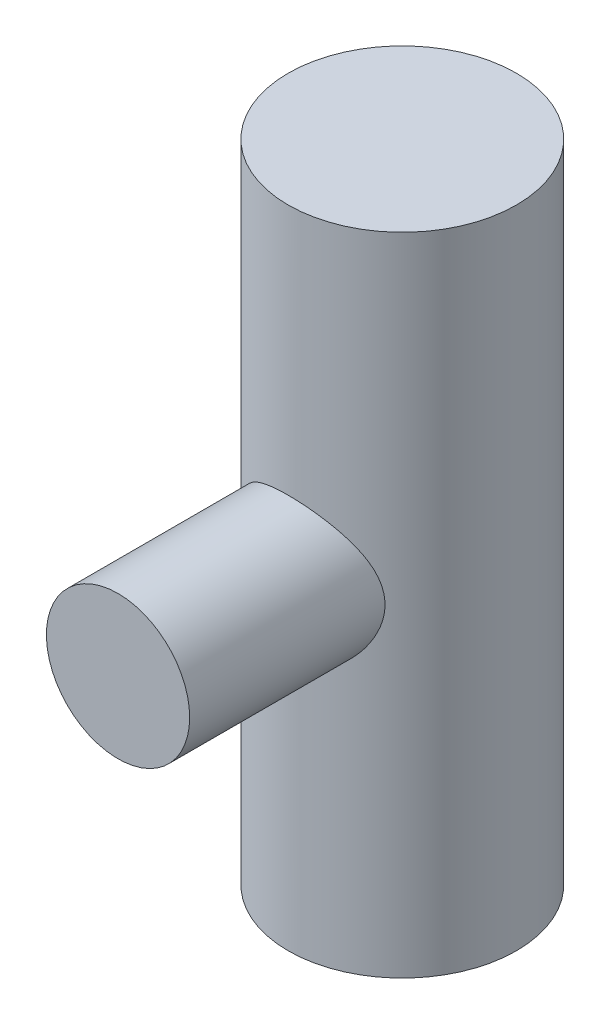
ISO-10303-21;
HEADER;
FILE_DESCRIPTION(('STEP AP214'),'2;1');
FILE_NAME('part.step','',(''),(''),'','','');
FILE_SCHEMA(('AUTOMOTIVE_DESIGN { 1 0 10303 214 1 1 1 1 }'));
ENDSEC;
DATA;
#1=APPLICATION_CONTEXT('core data for automotive mechanical design processes');
#2=APPLICATION_PROTOCOL_DEFINITION('international standard','automotive_design',2000,#1);
#3=PRODUCT_CONTEXT('',#1,'mechanical');
#4=PRODUCT('Part','Part','',(#3));
#5=PRODUCT_RELATED_PRODUCT_CATEGORY('part','',(#4));
#6=PRODUCT_DEFINITION_FORMATION('','',#4);
#7=PRODUCT_DEFINITION_CONTEXT('part definition',#1,'design');
#8=PRODUCT_DEFINITION('design','',#6,#7);
#9=PRODUCT_DEFINITION_SHAPE('','',#8);
#10=(LENGTH_UNIT() NAMED_UNIT(*) SI_UNIT(.MILLI.,.METRE.));
#11=(NAMED_UNIT(*) PLANE_ANGLE_UNIT() SI_UNIT($,.RADIAN.));
#12=(NAMED_UNIT(*) SI_UNIT($,.STERADIAN.) SOLID_ANGLE_UNIT());
#13=UNCERTAINTY_MEASURE_WITH_UNIT(LENGTH_MEASURE(1.E-05),#10,'distance_accuracy_value','');
#14=(GEOMETRIC_REPRESENTATION_CONTEXT(3) GLOBAL_UNCERTAINTY_ASSIGNED_CONTEXT((#13)) GLOBAL_UNIT_ASSIGNED_CONTEXT((#10,
#11,#12)) REPRESENTATION_CONTEXT('',''));
#15=CARTESIAN_POINT('',(0.,0.,0.));
#16=DIRECTION('',(0.,0.,1.));
#17=DIRECTION('',(1.,0.,0.));
#18=AXIS2_PLACEMENT_3D('',#15,#16,#17);
#19=CARTESIAN_POINT('',(0.,-36.068,0.));
#20=DIRECTION('',(0.,1.,0.));
#21=DIRECTION('',(0.,0.,1.));
#22=AXIS2_PLACEMENT_3D('',#19,#20,#21);
#23=CYLINDRICAL_SURFACE('',#22,12.75);
#24=CARTESIAN_POINT('',(0.,36.068,0.));
#25=DIRECTION('',(0.,1.,0.));
#26=DIRECTION('',(0.,0.,1.));
#27=AXIS2_PLACEMENT_3D('',#24,#25,#26);
#28=CIRCLE('',#27,12.75);
#29=CARTESIAN_POINT('',(0.,36.068,12.75));
#30=VERTEX_POINT('',#29);
#31=EDGE_CURVE('E40',#30,#30,#28,.T.);
#32=ORIENTED_EDGE('',*,*,#31,.F.);
#33=EDGE_LOOP('',(#32));
#34=FACE_BOUND('',#33,.T.);
#35=CARTESIAN_POINT('',(0.,-36.068,0.));
#36=DIRECTION('',(0.,1.,0.));
#37=DIRECTION('',(0.,0.,1.));
#38=AXIS2_PLACEMENT_3D('',#35,#36,#37);
#39=CIRCLE('',#38,12.75);
#40=CARTESIAN_POINT('',(0.,-36.068,12.75));
#41=VERTEX_POINT('',#40);
#42=EDGE_CURVE('E10',#41,#41,#39,.T.);
#43=ORIENTED_EDGE('',*,*,#42,.T.);
#44=EDGE_LOOP('',(#43));
#45=FACE_BOUND('',#44,.T.);
#46=CARTESIAN_POINT('',(0.,-8.,12.75));
#47=CARTESIAN_POINT('',(-0.203189766382973,-7.99999976383825,12.7499997385454));
#48=CARTESIAN_POINT('',(-0.406385873344213,-7.99224878717564,12.7451321833283));
#49=CARTESIAN_POINT('',(-0.811220632619126,-7.96135376545343,12.7257813143932));
#50=CARTESIAN_POINT('',(-1.01285859554946,-7.93820326193824,12.7112939662048));
#51=CARTESIAN_POINT('',(-1.41320253033448,-7.87679681695134,12.673036387307));
#52=CARTESIAN_POINT('',(-1.61190413876704,-7.83852036209049,12.6492535507999));
#53=CARTESIAN_POINT('',(-2.00474517611813,-7.74736580920391,12.5929699595354));
#54=CARTESIAN_POINT('',(-2.19888263941247,-7.69448154070404,12.5604655208598));
#55=CARTESIAN_POINT('',(-2.58021992043227,-7.57510194616457,12.4876916924987));
#56=CARTESIAN_POINT('',(-2.76745168430035,-7.50868208407942,12.4474654229557));
#57=CARTESIAN_POINT('',(-3.13511640751292,-7.36275664703233,12.3599868834508));
#58=CARTESIAN_POINT('',(-3.31554669892956,-7.2832460014248,12.3127318916383));
#59=CARTESIAN_POINT('',(-3.66859223478251,-7.1119547048222,12.2121901956111));
#60=CARTESIAN_POINT('',(-3.84121202735987,-7.02018132092362,12.1589070666131));
#61=CARTESIAN_POINT('',(-4.17810487907998,-6.82505455198789,12.0473019796715));
#62=CARTESIAN_POINT('',(-4.34237482156444,-6.72169688848159,11.9889781618623));
#63=CARTESIAN_POINT('',(-4.84727527708861,-6.37793884981828,11.7983972761313));
#64=CARTESIAN_POINT('',(-5.17176058125377,-6.11748738834776,11.6587628111541));
#65=CARTESIAN_POINT('',(-5.77529819934415,-5.5513559523854,11.3719103141199));
#66=CARTESIAN_POINT('',(-6.05428811176334,-5.24561493685909,11.2246822247398));
#67=CARTESIAN_POINT('',(-6.45301886625948,-4.73431922761001,10.9976725999898));
#68=CARTESIAN_POINT('',(-6.58955676700972,-4.5424068199267,10.9161809695766));
#69=CARTESIAN_POINT('',(-6.8459087898482,-4.14599149438221,10.75726511699));
#70=CARTESIAN_POINT('',(-6.9657197419189,-3.94148620052684,10.6798416675295));
#71=CARTESIAN_POINT('',(-7.18742899523231,-3.52097860064546,10.5319093402927));
#72=CARTESIAN_POINT('',(-7.28935148451823,-3.30499234201032,10.4613911834364));
#73=CARTESIAN_POINT('',(-7.47428711151578,-2.86225789214948,10.3300728197832));
#74=CARTESIAN_POINT('',(-7.55730815099648,-2.63551424614157,10.2692685552673));
#75=CARTESIAN_POINT('',(-7.68409465207724,-2.23312435302852,10.1745619472224));
#76=CARTESIAN_POINT('',(-7.73245018409908,-2.0595903102319,10.1377804382398));
#77=CARTESIAN_POINT('',(-7.81758346201417,-1.70822784010463,10.0722777906396));
#78=CARTESIAN_POINT('',(-7.85436403629735,-1.53040047331893,10.0435546831039));
#79=CARTESIAN_POINT('',(-7.91582572369715,-1.17165707333377,9.99518566956534));
#80=CARTESIAN_POINT('',(-7.9405211178199,-0.990744948392088,9.97552905131766));
#81=CARTESIAN_POINT('',(-7.97749960047348,-0.6268509257145,9.94598234779231));
#82=CARTESIAN_POINT('',(-7.98978252393051,-0.443869000484983,9.93609239240181));
#83=CARTESIAN_POINT('',(-8.00174593892089,-0.0767245670503763,9.926460752477));
#84=CARTESIAN_POINT('',(-8.00139208707587,0.107439798184548,9.9267467233835));
#85=CARTESIAN_POINT('',(-7.9880031448844,0.475003431836302,9.93752371706806));
#86=CARTESIAN_POINT('',(-7.97496798909817,0.65840269630005,9.94801479250789));
#87=CARTESIAN_POINT('',(-7.93642111826785,1.02317296232002,9.97879369925801));
#88=CARTESIAN_POINT('',(-7.91090071663604,1.2045424616742,9.99908835126532));
#89=CARTESIAN_POINT('',(-7.8477715182777,1.56389561654914,10.0487107647937));
#90=CARTESIAN_POINT('',(-7.81016245775423,1.74187919809311,10.0780387234377));
#91=CARTESIAN_POINT('',(-7.72441299215733,2.08917611342476,10.1439040046732));
#92=CARTESIAN_POINT('',(-7.67655057904199,2.25859503648008,10.1802489109241));
#93=CARTESIAN_POINT('',(-7.57029776768525,2.59255075648118,10.2595068482014));
#94=CARTESIAN_POINT('',(-7.511903805981,2.75708587892772,10.3024221016307));
#95=CARTESIAN_POINT('',(-7.32171394270438,3.24240671290514,10.4393205695113));
#96=CARTESIAN_POINT('',(-7.17486629518523,3.55508230101124,10.5414915639656));
#97=CARTESIAN_POINT('',(-6.81357494604446,4.21200831340229,10.7792689056088));
#98=CARTESIAN_POINT('',(-6.59161435299496,4.55115042306663,10.9175503621206));
#99=CARTESIAN_POINT('',(-6.22345802110474,5.03083226264147,11.1288471741934));
#100=CARTESIAN_POINT('',(-6.09475413060929,5.18599896574965,11.1999830698381));
#101=CARTESIAN_POINT('',(-5.82592487532627,5.48627408335127,11.3421422077003));
#102=CARTESIAN_POINT('',(-5.68579749696819,5.63138071622087,11.4131654277979));
#103=CARTESIAN_POINT('',(-5.37007805634996,5.93446421243214,11.5654845619847));
#104=CARTESIAN_POINT('',(-5.19248440791714,6.09050307762837,11.6464999462237));
#105=CARTESIAN_POINT('',(-4.8230825473081,6.38701344525527,11.8042658957195));
#106=CARTESIAN_POINT('',(-4.63127954061045,6.52749060198545,11.8810180049369));
#107=CARTESIAN_POINT('',(-4.23421273440465,6.79178290377598,12.0282489583426));
#108=CARTESIAN_POINT('',(-4.02894854898307,6.91559757083486,12.0987276225431));
#109=CARTESIAN_POINT('',(-3.60604740482221,7.1452287487665,12.2314354839807));
#110=CARTESIAN_POINT('',(-3.38841190724006,7.25104737925544,12.2936656525545));
#111=CARTESIAN_POINT('',(-2.95397045228584,7.43821234182123,12.4050050436619));
#112=CARTESIAN_POINT('',(-2.73772846851132,7.52055642983811,12.4546338717001));
#113=CARTESIAN_POINT('',(-2.29694556103576,7.66667693956907,12.5434071998914));
#114=CARTESIAN_POINT('',(-2.07240478159228,7.73045368386746,12.5825518821924));
#115=CARTESIAN_POINT('',(-1.61721562985751,7.83831959160341,12.6491088103432));
#116=CARTESIAN_POINT('',(-1.38657489588689,7.88243224676869,12.6765350540046));
#117=CARTESIAN_POINT('',(-0.921187858068242,7.95026275695523,12.7188234014957));
#118=CARTESIAN_POINT('',(-0.686442276062125,7.9739841617212,12.7336876921247));
#119=CARTESIAN_POINT('',(-0.250644531777243,7.99858946532225,12.7491124233029));
#120=CARTESIAN_POINT('',(-0.0498127312596073,8.00236208570209,12.7514820080524));
#121=CARTESIAN_POINT('',(0.351452186901355,7.99479433786285,12.7467338832671));
#122=CARTESIAN_POINT('',(0.551885324832788,7.98345475949558,12.7396166695679));
#123=CARTESIAN_POINT('',(0.950762116416681,7.94582804512612,12.7160713131565));
#124=CARTESIAN_POINT('',(1.14920596877124,7.91954241747637,12.6996441100071));
#125=CARTESIAN_POINT('',(1.54265466835032,7.85239108195215,12.6578771866512));
#126=CARTESIAN_POINT('',(1.73765945781951,7.81152512946112,12.6325373169156));
#127=CARTESIAN_POINT('',(2.11498001276337,7.71771293373013,12.5747479832677));
#128=CARTESIAN_POINT('',(2.29748815497252,7.66533100580571,12.5426328041609));
#129=CARTESIAN_POINT('',(2.65714293201942,7.5482034552834,12.4713958757544));
#130=CARTESIAN_POINT('',(2.83428781925331,7.48345385188672,12.4322718707679));
#131=CARTESIAN_POINT('',(3.18224650578,7.34224393021765,12.3477869413436));
#132=CARTESIAN_POINT('',(3.35306205014384,7.26578687011389,12.3024277525068));
#133=CARTESIAN_POINT('',(3.68773132198226,7.10178873317444,12.2062896502734));
#134=CARTESIAN_POINT('',(3.85158249120338,7.01424362952171,12.1555087689519));
#135=CARTESIAN_POINT('',(4.36380527796383,6.71734498806751,11.9857010580734));
#136=CARTESIAN_POINT('',(4.69783223403602,6.48781163009487,11.8578582209026));
#137=CARTESIAN_POINT('',(5.32489229930251,5.98395623612856,11.5898494186757));
#138=CARTESIAN_POINT('',(5.61787954952388,5.70958482666112,11.4496699485458));
#139=CARTESIAN_POINT('',(6.0437538721238,5.24648357872212,11.2279215695231));
#140=CARTESIAN_POINT('',(6.19164495365708,5.07110941057417,11.1468431361299));
#141=CARTESIAN_POINT('',(6.47216619253904,4.70784182500623,10.9863420676919));
#142=CARTESIAN_POINT('',(6.60479376230111,4.51994629336994,10.9069197152617));
#143=CARTESIAN_POINT('',(6.97849269995221,3.93860569749435,10.6746803636091));
#144=CARTESIAN_POINT('',(7.19587172274166,3.5269735508085,10.5276233511563));
#145=CARTESIAN_POINT('',(7.52073188913442,2.75245855212331,10.2972060064871));
#146=CARTESIAN_POINT('',(7.6416762386543,2.39730255916311,10.2069578831602));
#147=CARTESIAN_POINT('',(7.78545990744791,1.84992971206199,10.0971615445412));
#148=CARTESIAN_POINT('',(7.82710834127099,1.66509376723765,10.0648316640836));
#149=CARTESIAN_POINT('',(7.89734918116674,1.29149812638804,10.0098149238799));
#150=CARTESIAN_POINT('',(7.92594163830113,1.10273844571146,9.98712802642035));
#151=CARTESIAN_POINT('',(7.96971851480828,0.721539402684301,9.95222974525581));
#152=CARTESIAN_POINT('',(7.98482107493778,0.529084718476012,9.94008232968556));
#153=CARTESIAN_POINT('',(8.00104872241627,0.14320005907496,9.92702533209305));
#154=CARTESIAN_POINT('',(8.00217388418333,-0.0502299109197273,9.92611569023893));
#155=CARTESIAN_POINT('',(7.99042304943018,-0.436435604088139,9.93557717108292));
#156=CARTESIAN_POINT('',(7.97754315008174,-0.629211129865219,9.94595143829868));
#157=CARTESIAN_POINT('',(7.93801532607413,-1.01243389633159,9.97752713378894));
#158=CARTESIAN_POINT('',(7.91136762697396,-1.20288117511243,9.99872838468401));
#159=CARTESIAN_POINT('',(7.84756684935318,-1.56411069733939,10.0488649646799));
#160=CARTESIAN_POINT('',(7.81148923278864,-1.73519688744136,10.0769972774148));
#161=CARTESIAN_POINT('',(7.7286157880417,-2.07336399050864,10.1406963582305));
#162=CARTESIAN_POINT('',(7.68181639137217,-2.24044354946501,10.17626560117));
#163=CARTESIAN_POINT('',(7.52605879286744,-2.73451446676145,10.2926073929771));
#164=CARTESIAN_POINT('',(7.40171078092735,-3.05450664446697,10.3830390862903));
#165=CARTESIAN_POINT('',(7.09538822984088,-3.71576474072398,10.5951570126584));
#166=CARTESIAN_POINT('',(6.90770596774952,-4.05349754889184,10.7194658194389));
#167=CARTESIAN_POINT('',(6.48797839309739,-4.6961104700326,10.978590325681));
#168=CARTESIAN_POINT('',(6.25589749438276,-5.00096392112144,11.1134144015882));
#169=CARTESIAN_POINT('',(5.85165624336075,-5.45993192910108,11.3291798802275));
#170=CARTESIAN_POINT('',(5.69250613078194,-5.62567972367077,11.4101687607189));
#171=CARTESIAN_POINT('',(5.35994642118285,-5.94338646957418,11.5701117549875));
#172=CARTESIAN_POINT('',(5.18653554990932,-6.09534418615435,11.6490656861044));
#173=CARTESIAN_POINT('',(4.82601659330587,-6.38459169533055,11.8029875205485));
#174=CARTESIAN_POINT('',(4.63889953684033,-6.52187173371477,11.8779527567273));
#175=CARTESIAN_POINT('',(4.25180239536673,-6.78058740551841,12.02195140944));
#176=CARTESIAN_POINT('',(4.0518209816033,-6.90202139826898,12.090984211489));
#177=CARTESIAN_POINT('',(3.638817843119,-7.12844816537782,12.2216478117316));
#178=CARTESIAN_POINT('',(3.42572814909731,-7.23334305250242,12.2832340713893));
#179=CARTESIAN_POINT('',(2.988988482321,-7.42446751304267,12.3967458835699));
#180=CARTESIAN_POINT('',(2.76534468648368,-7.51070784320286,12.4486770010805));
#181=CARTESIAN_POINT('',(2.30970985237265,-7.66307948436307,12.5411973851701));
#182=CARTESIAN_POINT('',(2.07774294273341,-7.72926438025348,12.5818168506864));
#183=CARTESIAN_POINT('',(1.60714076391373,-7.84063067878577,12.6505360352971));
#184=CARTESIAN_POINT('',(1.36851048227381,-7.88582736684102,12.6786448650879));
#185=CARTESIAN_POINT('',(0.941528233520768,-7.94663089760269,12.7165650979446));
#186=CARTESIAN_POINT('',(0.754025703324688,-7.96662039193684,12.7290783601568));
#187=CARTESIAN_POINT('',(0.377683994988058,-7.99330545870886,12.7457961863256));
#188=CARTESIAN_POINT('',(0.188844735945044,-8.00000021948893,12.7500002429961));
#189=CARTESIAN_POINT('',(0.,-8.,12.75));
#190=B_SPLINE_CURVE_WITH_KNOTS('',3,(#46,#47,#48,#49,#50,#51,#52,#53,#54,#55,#56,#57,#58,#59,
#60,#61,#62,#63,#64,#65,#66,#67,#68,#69,#70,#71,#72,#73,#74,#75,#76,#77,#78,#79,#80,#81,#82,#83,
#84,#85,#86,#87,#88,#89,#90,#91,#92,#93,#94,#95,#96,#97,#98,#99,#100,#101,#102,#103,#104,#105,
#106,#107,#108,#109,#110,#111,#112,#113,#114,#115,#116,#117,#118,#119,#120,#121,#122,#123,#124,
#125,#126,#127,#128,#129,#130,#131,#132,#133,#134,#135,#136,#137,#138,#139,#140,#141,#142,#143,
#144,#145,#146,#147,#148,#149,#150,#151,#152,#153,#154,#155,#156,#157,#158,#159,#160,#161,#162,
#163,#164,#165,#166,#167,#168,#169,#170,#171,#172,#173,#174,#175,#176,#177,#178,#179,#180,#181,
#182,#183,#184,#185,#186,#187,#188,#189),.UNSPECIFIED.,.T.,.F.,(4,2,2,2,2,2,2,2,2,2,2,2,2,2,2,2,
2,2,2,2,2,2,2,2,2,2,2,2,2,2,2,2,2,2,2,2,2,2,2,2,2,2,2,2,2,2,2,2,2,2,2,2,2,2,2,2,2,2,2,2,2,2,2,2,
2,2,2,2,2,2,2,4),(0.,0.60937605436177,1.21900783811508,1.82946924035929,2.44018890246329,
3.04759250212018,3.65523193226284,4.26251284945736,4.87001879991724,6.18128644115812,
7.4943377594722,8.24124031111201,8.98828422083862,9.73431009317561,10.4800235136618,
11.031076671643,11.5819950727123,12.1322608742918,12.6825339937758,13.2343027220677,
13.7860742976865,14.3382303145307,14.8903983812603,15.4291544599414,15.9680931757158,
17.0454261856532,18.3252123059084,18.9661209311641,19.607142771987,20.3559403229354,
21.1044649019425,21.8530109495069,22.601468770376,23.3103728841878,24.0192646809448,
24.7273073146546,25.435226666083,26.037100939475,26.638943756634,27.2407258467076,
27.8425180334546,28.4196239604487,28.9969159552071,29.5740475814376,30.1513894073551,
31.4210529311863,32.6921240854455,33.421314531555,34.1506284140434,35.6069645129174,
36.7596958778446,37.3356930772665,37.9116880239527,38.4911549271887,39.0706187452412,
39.6502440854364,40.2298599298834,40.7605953445182,41.2915076589746,42.3528181691246,
43.566374584933,44.7809077902932,45.5111232513111,46.2414040309112,46.9721671489286,
47.7030058688106,48.4380196713038,49.1726085075205,49.9052169743043,50.6372910527362,
51.2036110853225,51.7699656912935),.UNSPECIFIED.);
#191=CARTESIAN_POINT('',(0.,-8.,12.75));
#192=VERTEX_POINT('',#191);
#193=EDGE_CURVE('E33',#192,#192,#190,.T.);
#194=ORIENTED_EDGE('',*,*,#193,.T.);
#195=EDGE_LOOP('',(#194));
#196=FACE_BOUND('',#195,.T.);
#197=ADVANCED_FACE('F29',(#34,#45,#196),#23,.T.);
#198=CARTESIAN_POINT('',(0.,-36.068,0.));
#199=DIRECTION('',(0.,1.,0.));
#200=DIRECTION('',(0.,0.,1.));
#201=AXIS2_PLACEMENT_3D('',#198,#199,#200);
#202=PLANE('',#201);
#203=ORIENTED_EDGE('',*,*,#42,.F.);
#204=EDGE_LOOP('',(#203));
#205=FACE_BOUND('',#204,.T.);
#206=ADVANCED_FACE('F64',(#205),#202,.F.);
#207=CARTESIAN_POINT('',(0.,36.068,0.));
#208=DIRECTION('',(0.,1.,0.));
#209=DIRECTION('',(0.,0.,1.));
#210=AXIS2_PLACEMENT_3D('',#207,#208,#209);
#211=PLANE('',#210);
#212=ORIENTED_EDGE('',*,*,#31,.T.);
#213=EDGE_LOOP('',(#212));
#214=FACE_BOUND('',#213,.T.);
#215=ADVANCED_FACE('F58',(#214),#211,.T.);
#216=CARTESIAN_POINT('',(0.,0.,31.75));
#217=DIRECTION('',(0.,0.,-1.));
#218=DIRECTION('',(-1.,0.,0.));
#219=AXIS2_PLACEMENT_3D('',#216,#217,#218);
#220=CYLINDRICAL_SURFACE('',#219,8.);
#221=ORIENTED_EDGE('',*,*,#193,.F.);
#222=EDGE_LOOP('',(#221));
#223=FACE_BOUND('',#222,.T.);
#224=CARTESIAN_POINT('',(0.,0.,31.75));
#225=DIRECTION('',(0.,0.,1.));
#226=DIRECTION('',(1.,0.,0.));
#227=AXIS2_PLACEMENT_3D('',#224,#225,#226);
#228=CIRCLE('',#227,8.);
#229=CARTESIAN_POINT('',(8.,0.,31.75));
#230=VERTEX_POINT('',#229);
#231=EDGE_CURVE('E46',#230,#230,#228,.T.);
#232=ORIENTED_EDGE('',*,*,#231,.F.);
#233=EDGE_LOOP('',(#232));
#234=FACE_BOUND('',#233,.T.);
#235=ADVANCED_FACE('F54',(#223,#234),#220,.T.);
#236=CARTESIAN_POINT('',(0.,0.,31.75));
#237=DIRECTION('',(0.,0.,1.));
#238=DIRECTION('',(1.,0.,0.));
#239=AXIS2_PLACEMENT_3D('',#236,#237,#238);
#240=PLANE('',#239);
#241=ORIENTED_EDGE('',*,*,#231,.T.);
#242=EDGE_LOOP('',(#241));
#243=FACE_BOUND('',#242,.T.);
#244=ADVANCED_FACE('F57',(#243),#240,.T.);
#245=CLOSED_SHELL('',(#197,#206,#215,#235,#244));
#246=MANIFOLD_SOLID_BREP('B2',#245);
#247=ADVANCED_BREP_SHAPE_REPRESENTATION('',(#18,#246),#14);
#248=SHAPE_DEFINITION_REPRESENTATION(#9,#247);
ENDSEC;
END-ISO-10303-21;
